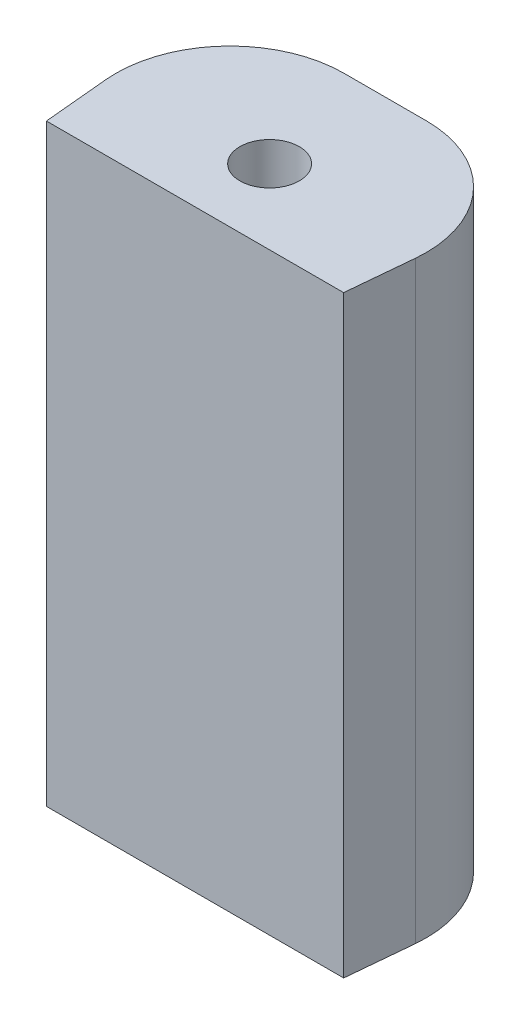
ISO-10303-21;
HEADER;
FILE_DESCRIPTION(('STEP AP214'),'2;1');
FILE_NAME('part.step','',(''),(''),'','','');
FILE_SCHEMA(('AUTOMOTIVE_DESIGN { 1 0 10303 214 1 1 1 1 }'));
ENDSEC;
DATA;
#1=APPLICATION_CONTEXT('core data for automotive mechanical design processes');
#2=APPLICATION_PROTOCOL_DEFINITION('international standard','automotive_design',2000,#1);
#3=PRODUCT_CONTEXT('',#1,'mechanical');
#4=PRODUCT('Part','Part','',(#3));
#5=PRODUCT_RELATED_PRODUCT_CATEGORY('part','',(#4));
#6=PRODUCT_DEFINITION_FORMATION('','',#4);
#7=PRODUCT_DEFINITION_CONTEXT('part definition',#1,'design');
#8=PRODUCT_DEFINITION('design','',#6,#7);
#9=PRODUCT_DEFINITION_SHAPE('','',#8);
#10=(LENGTH_UNIT() NAMED_UNIT(*) SI_UNIT(.MILLI.,.METRE.));
#11=(NAMED_UNIT(*) PLANE_ANGLE_UNIT() SI_UNIT($,.RADIAN.));
#12=(NAMED_UNIT(*) SI_UNIT($,.STERADIAN.) SOLID_ANGLE_UNIT());
#13=UNCERTAINTY_MEASURE_WITH_UNIT(LENGTH_MEASURE(1.E-05),#10,'distance_accuracy_value','');
#14=(GEOMETRIC_REPRESENTATION_CONTEXT(3) GLOBAL_UNCERTAINTY_ASSIGNED_CONTEXT((#13)) GLOBAL_UNIT_ASSIGNED_CONTEXT((#10,
#11,#12)) REPRESENTATION_CONTEXT('',''));
#15=CARTESIAN_POINT('',(0.,0.,0.));
#16=DIRECTION('',(0.,0.,1.));
#17=DIRECTION('',(1.,0.,0.));
#18=AXIS2_PLACEMENT_3D('',#15,#16,#17);
#19=CARTESIAN_POINT('',(-9.25951888196291,119.557853120565,99.8737783562964));
#20=DIRECTION('',(0.,-1.,0.));
#21=DIRECTION('',(0.,0.,-1.));
#22=AXIS2_PLACEMENT_3D('',#19,#20,#21);
#23=PLANE('',#22);
#24=CARTESIAN_POINT('',(1.10810856874065,119.557853120565,11.326456678177));
#25=DIRECTION('',(0.,-1.,0.));
#26=DIRECTION('',(0.,0.,-1.));
#27=AXIS2_PLACEMENT_3D('',#24,#25,#26);
#28=CIRCLE('',#27,1.984375);
#29=CARTESIAN_POINT('',(1.10810856874065,119.557853120565,9.342081678177));
#30=VERTEX_POINT('',#29);
#31=EDGE_CURVE('E175',#30,#30,#28,.T.);
#32=ORIENTED_EDGE('',*,*,#31,.T.);
#33=EDGE_LOOP('',(#32));
#34=FACE_BOUND('',#33,.T.);
#35=CARTESIAN_POINT('',(-9.95528734648911,119.557853120565,3.60745157283523));
#36=CARTESIAN_POINT('',(-9.89780564985951,119.557853120565,4.29681695227938));
#37=CARTESIAN_POINT('',(-9.41437139557562,119.557853120565,10.0160031655517));
#38=CARTESIAN_POINT('',(-8.88377675291906,119.557853120565,15.7302015711882));
#39=CARTESIAN_POINT('',(-8.38670742850917,119.557853120565,20.7524515728352));
#40=B_SPLINE_CURVE_WITH_KNOTS('',3,(#35,#36,#37,#38,#39),.UNSPECIFIED.,.F.,.F.,(4,1,4),
(0.384969625903912,0.394992547848154,0.46813159331185),.UNSPECIFIED.);
#41=CARTESIAN_POINT('',(-8.81846249460654,119.557853120565,16.3074515728352));
#42=VERTEX_POINT('',#41);
#43=CARTESIAN_POINT('',(-9.22789688315304,119.557853120565,11.9209350341043));
#44=VERTEX_POINT('',#43);
#45=EDGE_CURVE('E182',#42,#44,#40,.F.);
#46=ORIENTED_EDGE('',*,*,#45,.F.);
#47=DIRECTION('',(1.,0.,0.));
#48=VECTOR('',#47,1.);
#49=CARTESIAN_POINT('',(-35.7381827274976,119.557853120565,16.3074515728352));
#50=LINE('',#49,#48);
#51=CARTESIAN_POINT('',(11.0346547157934,119.557853120565,16.3074515728352));
#52=VERTEX_POINT('',#51);
#53=EDGE_CURVE('E93',#42,#52,#50,.T.);
#54=ORIENTED_EDGE('',*,*,#53,.T.);
#55=CARTESIAN_POINT('',(10.6028996496958,119.557853120565,20.7524515728353));
#56=CARTESIAN_POINT('',(11.0999689741058,119.557853120565,15.7302015711881));
#57=CARTESIAN_POINT('',(11.6305636167611,119.557853120565,10.0160031655713));
#58=CARTESIAN_POINT('',(12.113997871047,119.557853120565,4.29681695227808));
#59=CARTESIAN_POINT('',(12.1714795676765,119.557853120565,3.60745157283523));
#60=B_SPLINE_CURVE_WITH_KNOTS('',3,(#55,#56,#57,#58,#59),.UNSPECIFIED.,.F.,.F.,(4,1,4),
(0.384969625903911,0.458108671367609,0.468131593311824),.UNSPECIFIED.);
#61=CARTESIAN_POINT('',(11.44408910434,119.557853120565,11.9209350341047));
#62=VERTEX_POINT('',#61);
#63=EDGE_CURVE('E189',#62,#52,#60,.F.);
#64=ORIENTED_EDGE('',*,*,#63,.F.);
#65=CARTESIAN_POINT('',(3.85571110314996,119.557853120565,11.2274515728352));
#66=DIRECTION('',(0.,-1.,0.));
#67=DIRECTION('',(0.,0.,-1.));
#68=AXIS2_PLACEMENT_3D('',#65,#66,#67);
#69=CIRCLE('',#68,7.62);
#70=CARTESIAN_POINT('',(3.85571110314996,119.557853120565,3.60745157283523));
#71=VERTEX_POINT('',#70);
#72=EDGE_CURVE('E198',#62,#71,#69,.F.);
#73=ORIENTED_EDGE('',*,*,#72,.T.);
#74=DIRECTION('',(1.,0.,0.));
#75=VECTOR('',#74,1.);
#76=CARTESIAN_POINT('',(-9.25951888196291,119.557853120565,3.60745157283523));
#77=LINE('',#76,#75);
#78=CARTESIAN_POINT('',(-1.63951888196291,119.557853120565,3.60745157283523));
#79=VERTEX_POINT('',#78);
#80=EDGE_CURVE('E98',#79,#71,#77,.T.);
#81=ORIENTED_EDGE('',*,*,#80,.F.);
#82=CARTESIAN_POINT('',(-1.63951888196291,119.557853120565,11.2274515728352));
#83=DIRECTION('',(0.,-1.,0.));
#84=DIRECTION('',(0.,0.,-1.));
#85=AXIS2_PLACEMENT_3D('',#82,#83,#84);
#86=CIRCLE('',#85,7.62);
#87=EDGE_CURVE('E177',#79,#44,#86,.F.);
#88=ORIENTED_EDGE('',*,*,#87,.T.);
#89=EDGE_LOOP('',(#46,#54,#64,#73,#81,#88));
#90=FACE_BOUND('',#89,.T.);
#91=ADVANCED_FACE('F38',(#34,#90),#23,.F.);
#92=CARTESIAN_POINT('',(-9.25951888196291,79.9109931205647,99.8737783562964));
#93=DIRECTION('',(0.,1.,0.));
#94=DIRECTION('',(0.,0.,1.));
#95=AXIS2_PLACEMENT_3D('',#92,#93,#94);
#96=PLANE('',#95);
#97=CARTESIAN_POINT('',(1.10810856874065,79.9109931205647,11.326456678177));
#98=DIRECTION('',(0.,1.,0.));
#99=DIRECTION('',(0.,0.,1.));
#100=AXIS2_PLACEMENT_3D('',#97,#98,#99);
#101=CIRCLE('',#100,1.984375);
#102=CARTESIAN_POINT('',(1.10810856874065,79.9109931205647,13.310831678177));
#103=VERTEX_POINT('',#102);
#104=EDGE_CURVE('E115',#103,#103,#101,.T.);
#105=ORIENTED_EDGE('',*,*,#104,.T.);
#106=EDGE_LOOP('',(#105));
#107=FACE_BOUND('',#106,.T.);
#108=CARTESIAN_POINT('',(10.6028996496958,79.9109931205647,20.7524515728353));
#109=CARTESIAN_POINT('',(11.0999689741058,79.9109931205647,15.7302015711881));
#110=CARTESIAN_POINT('',(11.6305636167611,79.9109931205647,10.0160031655713));
#111=CARTESIAN_POINT('',(12.113997871047,79.9109931205647,4.29681695227808));
#112=CARTESIAN_POINT('',(12.1714795676765,79.9109931205647,3.60745157283523));
#113=B_SPLINE_CURVE_WITH_KNOTS('',3,(#108,#109,#110,#111,#112),.UNSPECIFIED.,.F.,.F.,(4,1,4),
(0.384969625903911,0.458108671367609,0.468131593311824),.UNSPECIFIED.);
#114=CARTESIAN_POINT('',(11.0346547157935,79.9109931205647,16.3074515728668));
#115=VERTEX_POINT('',#114);
#116=CARTESIAN_POINT('',(11.44408910434,79.9109931205647,11.9209350341047));
#117=VERTEX_POINT('',#116);
#118=EDGE_CURVE('E106',#115,#117,#113,.T.);
#119=ORIENTED_EDGE('',*,*,#118,.F.);
#120=DIRECTION('',(1.,0.,0.));
#121=VECTOR('',#120,1.);
#122=CARTESIAN_POINT('',(-35.7381827274976,79.9109931205647,16.3074515728352));
#123=LINE('',#122,#121);
#124=CARTESIAN_POINT('',(-8.81846249460654,79.9109931205647,16.3074515728352));
#125=VERTEX_POINT('',#124);
#126=EDGE_CURVE('E54',#125,#115,#123,.T.);
#127=ORIENTED_EDGE('',*,*,#126,.F.);
#128=CARTESIAN_POINT('',(-9.95528734648911,79.9109931205647,3.60745157283523));
#129=CARTESIAN_POINT('',(-9.89780564985951,79.9109931205647,4.29681695227938));
#130=CARTESIAN_POINT('',(-9.41437139557562,79.9109931205647,10.0160031655517));
#131=CARTESIAN_POINT('',(-8.88377675291906,79.9109931205647,15.7302015711882));
#132=CARTESIAN_POINT('',(-8.38670742850917,79.9109931205647,20.7524515728352));
#133=B_SPLINE_CURVE_WITH_KNOTS('',3,(#128,#129,#130,#131,#132),.UNSPECIFIED.,.F.,.F.,(4,1,4),
(0.384969625903912,0.394992547848154,0.46813159331185),.UNSPECIFIED.);
#134=CARTESIAN_POINT('',(-9.22789688315304,79.9109931205647,11.9209350341043));
#135=VERTEX_POINT('',#134);
#136=EDGE_CURVE('E103',#135,#125,#133,.T.);
#137=ORIENTED_EDGE('',*,*,#136,.F.);
#138=CARTESIAN_POINT('',(-1.63951888196291,79.9109931205647,11.2274515728352));
#139=DIRECTION('',(0.,1.,0.));
#140=DIRECTION('',(0.,0.,1.));
#141=AXIS2_PLACEMENT_3D('',#138,#139,#140);
#142=CIRCLE('',#141,7.62);
#143=CARTESIAN_POINT('',(-1.63951888196291,79.9109931205647,3.60745157283523));
#144=VERTEX_POINT('',#143);
#145=EDGE_CURVE('E61',#135,#144,#142,.F.);
#146=ORIENTED_EDGE('',*,*,#145,.T.);
#147=DIRECTION('',(1.,0.,0.));
#148=VECTOR('',#147,1.);
#149=CARTESIAN_POINT('',(-9.25951888196291,79.9109931205647,3.60745157283523));
#150=LINE('',#149,#148);
#151=CARTESIAN_POINT('',(3.85571110314996,79.9109931205647,3.60745157283523));
#152=VERTEX_POINT('',#151);
#153=EDGE_CURVE('E204',#144,#152,#150,.T.);
#154=ORIENTED_EDGE('',*,*,#153,.T.);
#155=CARTESIAN_POINT('',(3.85571110314996,79.9109931205647,11.2274515728352));
#156=DIRECTION('',(0.,1.,0.));
#157=DIRECTION('',(0.,0.,1.));
#158=AXIS2_PLACEMENT_3D('',#155,#156,#157);
#159=CIRCLE('',#158,7.62);
#160=EDGE_CURVE('E117',#152,#117,#159,.F.);
#161=ORIENTED_EDGE('',*,*,#160,.T.);
#162=EDGE_LOOP('',(#119,#127,#137,#146,#154,#161));
#163=FACE_BOUND('',#162,.T.);
#164=ADVANCED_FACE('F102',(#107,#163),#96,.F.);
#165=CARTESIAN_POINT('',(-1.63951888196291,84.93633,11.2274515728352));
#166=DIRECTION('',(0.,-1.,0.));
#167=DIRECTION('',(0.,0.,-1.));
#168=AXIS2_PLACEMENT_3D('',#165,#166,#167);
#169=CYLINDRICAL_SURFACE('',#168,7.62);
#170=ORIENTED_EDGE('',*,*,#145,.F.);
#171=DIRECTION('',(0.,-1.,0.));
#172=VECTOR('',#171,1.);
#173=CARTESIAN_POINT('',(-9.22789688315304,146.81454,11.9209350341043));
#174=LINE('',#173,#172);
#175=EDGE_CURVE('E110',#44,#135,#174,.T.);
#176=ORIENTED_EDGE('',*,*,#175,.F.);
#177=ORIENTED_EDGE('',*,*,#87,.F.);
#178=DIRECTION('',(0.,-1.,0.));
#179=VECTOR('',#178,1.);
#180=CARTESIAN_POINT('',(-1.63951888196291,169.87266,3.60745157283523));
#181=LINE('',#180,#179);
#182=EDGE_CURVE('E217',#144,#79,#181,.F.);
#183=ORIENTED_EDGE('',*,*,#182,.F.);
#184=EDGE_LOOP('',(#170,#176,#177,#183));
#185=FACE_BOUND('',#184,.T.);
#186=ADVANCED_FACE('F150',(#185),#169,.T.);
#187=CARTESIAN_POINT('',(-9.95528734648911,169.87266,3.60745157283523));
#188=CARTESIAN_POINT('',(-9.89780564985951,169.87266,4.29681695227938));
#189=CARTESIAN_POINT('',(-9.41437139557562,169.87266,10.0160031655517));
#190=CARTESIAN_POINT('',(-8.88377675291906,169.87266,15.7302015711882));
#191=CARTESIAN_POINT('',(-8.38670742850917,169.87266,20.7524515728352));
#192=B_SPLINE_CURVE_WITH_KNOTS('',3,(#187,#188,#189,#190,#191),.UNSPECIFIED.,.F.,.F.,(4,1,4),
(0.384969625903912,0.394992547848154,0.46813159331185),.UNSPECIFIED.);
#193=DIRECTION('',(0.,-1.,0.));
#194=VECTOR('',#193,1.);
#195=SURFACE_OF_LINEAR_EXTRUSION('',#192,#194);
#196=ORIENTED_EDGE('',*,*,#136,.T.);
#197=DIRECTION('',(0.,-1.,0.));
#198=VECTOR('',#197,1.);
#199=CARTESIAN_POINT('',(-8.81846249460968,99.7344231205647,16.3074515728352));
#200=LINE('',#199,#198);
#201=EDGE_CURVE('E90',#125,#42,#200,.F.);
#202=ORIENTED_EDGE('',*,*,#201,.T.);
#203=ORIENTED_EDGE('',*,*,#45,.T.);
#204=ORIENTED_EDGE('',*,*,#175,.T.);
#205=EDGE_LOOP('',(#196,#202,#203,#204));
#206=FACE_BOUND('',#205,.T.);
#207=ADVANCED_FACE('F109',(#206),#195,.F.);
#208=CARTESIAN_POINT('',(3.85571110314996,84.93633,11.2274515728352));
#209=DIRECTION('',(0.,-1.,0.));
#210=DIRECTION('',(0.,0.,-1.));
#211=AXIS2_PLACEMENT_3D('',#208,#209,#210);
#212=CYLINDRICAL_SURFACE('',#211,7.62);
#213=ORIENTED_EDGE('',*,*,#160,.F.);
#214=DIRECTION('',(0.,-1.,0.));
#215=VECTOR('',#214,1.);
#216=CARTESIAN_POINT('',(3.85571110314996,169.87266,3.60745157283523));
#217=LINE('',#216,#215);
#218=EDGE_CURVE('E220',#71,#152,#217,.T.);
#219=ORIENTED_EDGE('',*,*,#218,.F.);
#220=ORIENTED_EDGE('',*,*,#72,.F.);
#221=DIRECTION('',(0.,-1.,0.));
#222=VECTOR('',#221,1.);
#223=CARTESIAN_POINT('',(11.44408910434,23.05812,11.9209350341047));
#224=LINE('',#223,#222);
#225=EDGE_CURVE('E47',#117,#62,#224,.F.);
#226=ORIENTED_EDGE('',*,*,#225,.F.);
#227=EDGE_LOOP('',(#213,#219,#220,#226));
#228=FACE_BOUND('',#227,.T.);
#229=ADVANCED_FACE('F40',(#228),#212,.T.);
#230=CARTESIAN_POINT('',(-9.95528734648911,169.87266,3.60745157283523));
#231=DIRECTION('',(0.,0.,1.));
#232=DIRECTION('',(1.,0.,0.));
#233=AXIS2_PLACEMENT_3D('',#230,#231,#232);
#234=PLANE('',#233);
#235=ORIENTED_EDGE('',*,*,#218,.T.);
#236=ORIENTED_EDGE('',*,*,#153,.F.);
#237=ORIENTED_EDGE('',*,*,#182,.T.);
#238=ORIENTED_EDGE('',*,*,#80,.T.);
#239=EDGE_LOOP('',(#235,#236,#237,#238));
#240=FACE_BOUND('',#239,.T.);
#241=ADVANCED_FACE('F147',(#240),#234,.F.);
#242=CARTESIAN_POINT('',(10.6028996496958,169.87266,20.7524515728353));
#243=CARTESIAN_POINT('',(11.0999689741058,169.87266,15.7302015711881));
#244=CARTESIAN_POINT('',(11.6305636167611,169.87266,10.0160031655713));
#245=CARTESIAN_POINT('',(12.113997871047,169.87266,4.29681695227808));
#246=CARTESIAN_POINT('',(12.1714795676765,169.87266,3.60745157283523));
#247=B_SPLINE_CURVE_WITH_KNOTS('',3,(#242,#243,#244,#245,#246),.UNSPECIFIED.,.F.,.F.,(4,1,4),
(0.384969625903911,0.458108671367609,0.468131593311824),.UNSPECIFIED.);
#248=DIRECTION('',(0.,-1.,0.));
#249=VECTOR('',#248,1.);
#250=SURFACE_OF_LINEAR_EXTRUSION('',#247,#249);
#251=ORIENTED_EDGE('',*,*,#63,.T.);
#252=DIRECTION('',(0.,-1.,0.));
#253=VECTOR('',#252,1.);
#254=CARTESIAN_POINT('',(11.0346547157965,99.7344231205647,16.3074515728352));
#255=LINE('',#254,#253);
#256=EDGE_CURVE('E11',#52,#115,#255,.T.);
#257=ORIENTED_EDGE('',*,*,#256,.T.);
#258=ORIENTED_EDGE('',*,*,#118,.T.);
#259=ORIENTED_EDGE('',*,*,#225,.T.);
#260=EDGE_LOOP('',(#251,#257,#258,#259));
#261=FACE_BOUND('',#260,.T.);
#262=ADVANCED_FACE('F143',(#261),#250,.F.);
#263=CARTESIAN_POINT('',(1.10810856874065,169.87266,11.326456678177));
#264=DIRECTION('',(0.,-1.,0.));
#265=DIRECTION('',(0.,0.,-1.));
#266=AXIS2_PLACEMENT_3D('',#263,#264,#265);
#267=CYLINDRICAL_SURFACE('',#266,1.984375);
#268=ORIENTED_EDGE('',*,*,#104,.F.);
#269=EDGE_LOOP('',(#268));
#270=FACE_BOUND('',#269,.T.);
#271=ORIENTED_EDGE('',*,*,#31,.F.);
#272=EDGE_LOOP('',(#271));
#273=FACE_BOUND('',#272,.T.);
#274=ADVANCED_FACE('F146',(#270,#273),#267,.F.);
#275=CARTESIAN_POINT('',(-35.7381827274976,119.557853120565,16.3074515728352));
#276=DIRECTION('',(0.,0.,-1.));
#277=DIRECTION('',(-1.,0.,0.));
#278=AXIS2_PLACEMENT_3D('',#275,#276,#277);
#279=PLANE('',#278);
#280=ORIENTED_EDGE('',*,*,#126,.T.);
#281=ORIENTED_EDGE('',*,*,#256,.F.);
#282=ORIENTED_EDGE('',*,*,#53,.F.);
#283=ORIENTED_EDGE('',*,*,#201,.F.);
#284=EDGE_LOOP('',(#280,#281,#282,#283));
#285=FACE_BOUND('',#284,.T.);
#286=ADVANCED_FACE('F91',(#285),#279,.F.);
#287=CLOSED_SHELL('',(#91,#164,#186,#207,#229,#241,#262,#274,#286));
#288=MANIFOLD_SOLID_BREP('B2',#287);
#289=ADVANCED_BREP_SHAPE_REPRESENTATION('',(#18,#288),#14);
#290=SHAPE_DEFINITION_REPRESENTATION(#9,#289);
ENDSEC;
END-ISO-10303-21;
